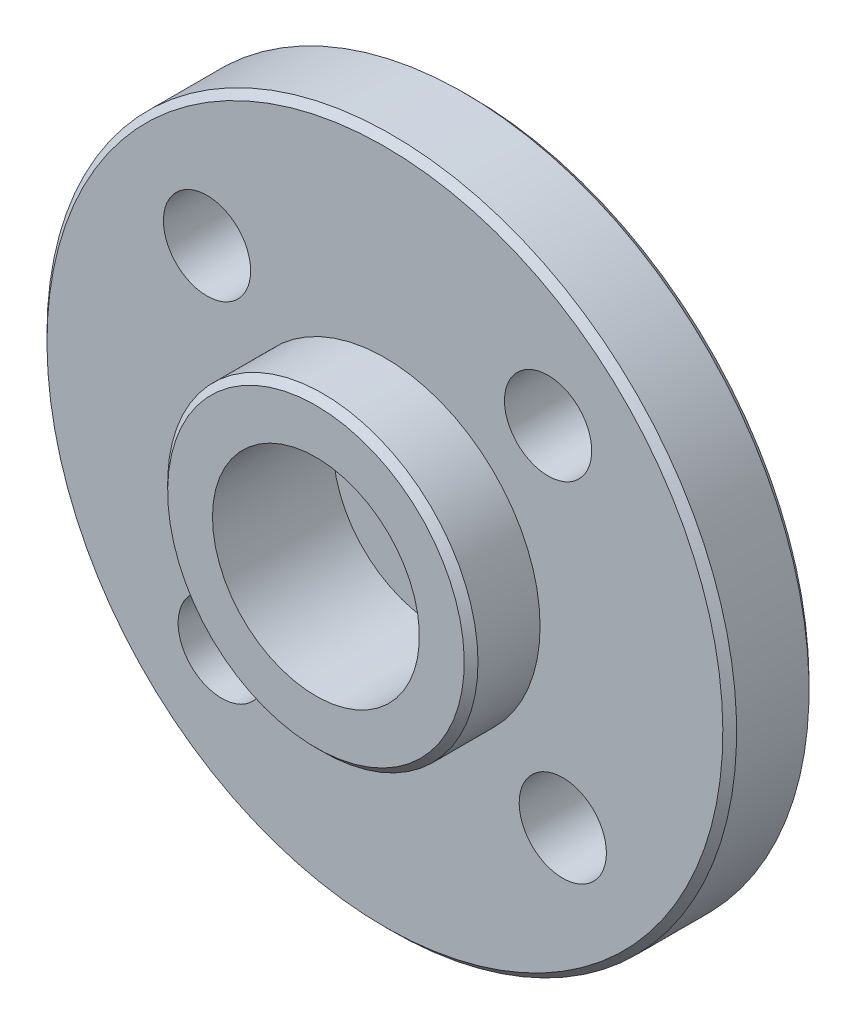
ISO-10303-21;
HEADER;
FILE_DESCRIPTION(('STEP AP214'),'2;1');
FILE_NAME('part.step','',(''),(''),'','','');
FILE_SCHEMA(('AUTOMOTIVE_DESIGN { 1 0 10303 214 1 1 1 1 }'));
ENDSEC;
DATA;
#1=APPLICATION_CONTEXT('core data for automotive mechanical design processes');
#2=APPLICATION_PROTOCOL_DEFINITION('international standard','automotive_design',2000,#1);
#3=PRODUCT_CONTEXT('',#1,'mechanical');
#4=PRODUCT('Part','Part','',(#3));
#5=PRODUCT_RELATED_PRODUCT_CATEGORY('part','',(#4));
#6=PRODUCT_DEFINITION_FORMATION('','',#4);
#7=PRODUCT_DEFINITION_CONTEXT('part definition',#1,'design');
#8=PRODUCT_DEFINITION('design','',#6,#7);
#9=PRODUCT_DEFINITION_SHAPE('','',#8);
#10=(LENGTH_UNIT() NAMED_UNIT(*) SI_UNIT(.MILLI.,.METRE.));
#11=(NAMED_UNIT(*) PLANE_ANGLE_UNIT() SI_UNIT($,.RADIAN.));
#12=(NAMED_UNIT(*) SI_UNIT($,.STERADIAN.) SOLID_ANGLE_UNIT());
#13=UNCERTAINTY_MEASURE_WITH_UNIT(LENGTH_MEASURE(1.E-05),#10,'distance_accuracy_value','');
#14=(GEOMETRIC_REPRESENTATION_CONTEXT(3) GLOBAL_UNCERTAINTY_ASSIGNED_CONTEXT((#13)) GLOBAL_UNIT_ASSIGNED_CONTEXT((#10,
#11,#12)) REPRESENTATION_CONTEXT('',''));
#15=CARTESIAN_POINT('',(0.,0.,0.));
#16=DIRECTION('',(0.,0.,1.));
#17=DIRECTION('',(1.,0.,0.));
#18=AXIS2_PLACEMENT_3D('',#15,#16,#17);
#19=CARTESIAN_POINT('',(44.7320254454184,27.9082880090144,-210.65));
#20=DIRECTION('',(0.,0.,-1.));
#21=DIRECTION('',(0.736898287001867,-0.676003635059542,0.));
#22=AXIS2_PLACEMENT_3D('',#19,#20,#21);
#23=CYLINDRICAL_SURFACE('',#22,1.2645);
#24=CARTESIAN_POINT('',(44.7320254454184,27.9082880090144,-206.15));
#25=DIRECTION('',(0.,0.,-1.));
#26=DIRECTION('',(0.736898287001867,-0.676003635059542,0.));
#27=AXIS2_PLACEMENT_3D('',#24,#25,#26);
#28=CIRCLE('',#27,1.2645);
#29=CARTESIAN_POINT('',(43.8002175615045,28.7630946055472,-206.15));
#30=VERTEX_POINT('',#29);
#31=EDGE_CURVE('E212',#30,#30,#28,.T.);
#32=ORIENTED_EDGE('',*,*,#31,.F.);
#33=DIRECTION('',(0.,0.,-1.));
#34=VECTOR('',#33,1.);
#35=CARTESIAN_POINT('',(43.8002175615045,28.7630946055472,-210.65));
#36=LINE('',#35,#34);
#37=CARTESIAN_POINT('',(43.8002175615045,28.7630946055472,-208.65));
#38=VERTEX_POINT('',#37);
#39=EDGE_CURVE('E11',#30,#38,#36,.T.);
#40=ORIENTED_EDGE('',*,*,#39,.T.);
#41=CARTESIAN_POINT('',(44.7320254454184,27.9082880090144,-208.65));
#42=DIRECTION('',(0.,0.,1.));
#43=DIRECTION('',(0.736898287001867,-0.676003635059542,0.));
#44=AXIS2_PLACEMENT_3D('',#41,#42,#43);
#45=CIRCLE('',#44,1.2645);
#46=EDGE_CURVE('E20',#38,#38,#45,.T.);
#47=ORIENTED_EDGE('',*,*,#46,.F.);
#48=ORIENTED_EDGE('',*,*,#39,.F.);
#49=EDGE_LOOP('',(#32,#40,#47,#48));
#50=FACE_BOUND('',#49,.T.);
#51=ADVANCED_FACE('F16',(#50),#23,.F.);
#52=CARTESIAN_POINT('',(34.8417119909885,27.4820254454181,-210.65));
#53=DIRECTION('',(0.,0.,-1.));
#54=DIRECTION('',(0.676003635059542,0.736898287001867,0.));
#55=AXIS2_PLACEMENT_3D('',#52,#53,#54);
#56=CYLINDRICAL_SURFACE('',#55,1.2645);
#57=CARTESIAN_POINT('',(34.8417119909885,27.4820254454181,-206.15));
#58=DIRECTION('',(0.,0.,-1.));
#59=DIRECTION('',(0.676003635059542,0.736898287001867,0.));
#60=AXIS2_PLACEMENT_3D('',#57,#58,#59);
#61=CIRCLE('',#60,1.2645);
#62=CARTESIAN_POINT('',(33.9869053944557,26.5502175615043,-206.15));
#63=VERTEX_POINT('',#62);
#64=EDGE_CURVE('E156',#63,#63,#61,.T.);
#65=ORIENTED_EDGE('',*,*,#64,.F.);
#66=DIRECTION('',(0.,0.,-1.));
#67=VECTOR('',#66,1.);
#68=CARTESIAN_POINT('',(33.9869053944557,26.5502175615042,-210.65));
#69=LINE('',#68,#67);
#70=CARTESIAN_POINT('',(33.9869053944557,26.5502175615043,-208.65));
#71=VERTEX_POINT('',#70);
#72=EDGE_CURVE('E27',#63,#71,#69,.T.);
#73=ORIENTED_EDGE('',*,*,#72,.T.);
#74=CARTESIAN_POINT('',(34.8417119909885,27.4820254454181,-208.65));
#75=DIRECTION('',(0.,0.,1.));
#76=DIRECTION('',(0.676003635059542,0.736898287001867,0.));
#77=AXIS2_PLACEMENT_3D('',#74,#75,#76);
#78=CIRCLE('',#77,1.2645);
#79=EDGE_CURVE('E167',#71,#71,#78,.T.);
#80=ORIENTED_EDGE('',*,*,#79,.F.);
#81=ORIENTED_EDGE('',*,*,#72,.F.);
#82=EDGE_LOOP('',(#65,#73,#80,#81));
#83=FACE_BOUND('',#82,.T.);
#84=ADVANCED_FACE('F275',(#83),#56,.F.);
#85=CARTESIAN_POINT('',(35.2679745545848,17.5917119909882,-210.65));
#86=DIRECTION('',(0.,0.,-1.));
#87=DIRECTION('',(-0.736898287001867,0.676003635059542,0.));
#88=AXIS2_PLACEMENT_3D('',#85,#86,#87);
#89=CYLINDRICAL_SURFACE('',#88,1.2645);
#90=CARTESIAN_POINT('',(35.2679745545848,17.5917119909883,-206.15));
#91=DIRECTION('',(0.,0.,-1.));
#92=DIRECTION('',(-0.736898287001867,0.676003635059542,0.));
#93=AXIS2_PLACEMENT_3D('',#90,#91,#92);
#94=CIRCLE('',#93,1.2645);
#95=CARTESIAN_POINT('',(36.1997824384987,16.7369053944555,-206.15));
#96=VERTEX_POINT('',#95);
#97=EDGE_CURVE('E151',#96,#96,#94,.T.);
#98=ORIENTED_EDGE('',*,*,#97,.F.);
#99=DIRECTION('',(0.,0.,-1.));
#100=VECTOR('',#99,1.);
#101=CARTESIAN_POINT('',(36.1997824384987,16.7369053944554,-210.65));
#102=LINE('',#101,#100);
#103=CARTESIAN_POINT('',(36.1997824384987,16.7369053944555,-208.65));
#104=VERTEX_POINT('',#103);
#105=EDGE_CURVE('E170',#96,#104,#102,.T.);
#106=ORIENTED_EDGE('',*,*,#105,.T.);
#107=CARTESIAN_POINT('',(35.2679745545848,17.5917119909883,-208.65));
#108=DIRECTION('',(0.,0.,1.));
#109=DIRECTION('',(-0.736898287001867,0.676003635059542,0.));
#110=AXIS2_PLACEMENT_3D('',#107,#108,#109);
#111=CIRCLE('',#110,1.2645);
#112=EDGE_CURVE('E164',#104,#104,#111,.T.);
#113=ORIENTED_EDGE('',*,*,#112,.F.);
#114=ORIENTED_EDGE('',*,*,#105,.F.);
#115=EDGE_LOOP('',(#98,#106,#113,#114));
#116=FACE_BOUND('',#115,.T.);
#117=ADVANCED_FACE('F281',(#116),#89,.F.);
#118=CARTESIAN_POINT('',(45.1582880090147,18.0179745545845,-210.65));
#119=DIRECTION('',(0.,0.,-1.));
#120=DIRECTION('',(-0.676003635059542,-0.736898287001867,0.));
#121=AXIS2_PLACEMENT_3D('',#118,#119,#120);
#122=CYLINDRICAL_SURFACE('',#121,1.2645);
#123=CARTESIAN_POINT('',(45.1582880090147,18.0179745545846,-206.15));
#124=DIRECTION('',(0.,0.,-1.));
#125=DIRECTION('',(-0.676003635059542,-0.736898287001867,0.));
#126=AXIS2_PLACEMENT_3D('',#123,#124,#125);
#127=CIRCLE('',#126,1.2645);
#128=CARTESIAN_POINT('',(46.0130946055474,18.9497824384984,-206.15));
#129=VERTEX_POINT('',#128);
#130=EDGE_CURVE('E155',#129,#129,#127,.T.);
#131=ORIENTED_EDGE('',*,*,#130,.F.);
#132=DIRECTION('',(0.,0.,-1.));
#133=VECTOR('',#132,1.);
#134=CARTESIAN_POINT('',(46.0130946055475,18.9497824384984,-210.65));
#135=LINE('',#134,#133);
#136=CARTESIAN_POINT('',(46.0130946055475,18.9497824384984,-208.65));
#137=VERTEX_POINT('',#136);
#138=EDGE_CURVE('E163',#129,#137,#135,.T.);
#139=ORIENTED_EDGE('',*,*,#138,.T.);
#140=CARTESIAN_POINT('',(45.1582880090147,18.0179745545845,-208.65));
#141=DIRECTION('',(0.,0.,1.));
#142=DIRECTION('',(-0.676003635059542,-0.736898287001867,0.));
#143=AXIS2_PLACEMENT_3D('',#140,#141,#142);
#144=CIRCLE('',#143,1.2645);
#145=EDGE_CURVE('E168',#137,#137,#144,.T.);
#146=ORIENTED_EDGE('',*,*,#145,.F.);
#147=ORIENTED_EDGE('',*,*,#138,.F.);
#148=EDGE_LOOP('',(#131,#139,#146,#147));
#149=FACE_BOUND('',#148,.T.);
#150=ADVANCED_FACE('F250',(#149),#122,.F.);
#151=CARTESIAN_POINT('',(40.0000000000016,22.7500000000013,-207.65));
#152=DIRECTION('',(0.,0.,1.));
#153=DIRECTION('',(0.736898287001867,-0.676003635059542,0.));
#154=AXIS2_PLACEMENT_3D('',#151,#152,#153);
#155=PLANE('',#154);
#156=CARTESIAN_POINT('',(40.0000000000016,22.7500000000013,-207.65));
#157=DIRECTION('',(0.,0.,-1.));
#158=DIRECTION('',(0.736898287001867,-0.676003635059542,0.));
#159=AXIS2_PLACEMENT_3D('',#156,#157,#158);
#160=CIRCLE('',#159,1.5);
#161=CARTESIAN_POINT('',(38.8946525694988,23.7640054525906,-207.65));
#162=VERTEX_POINT('',#161);
#163=EDGE_CURVE('E145',#162,#162,#160,.T.);
#164=ORIENTED_EDGE('',*,*,#163,.T.);
#165=EDGE_LOOP('',(#164));
#166=FACE_BOUND('',#165,.T.);
#167=CARTESIAN_POINT('',(40.0000000000016,22.7500000000013,-207.65));
#168=DIRECTION('',(0.,0.,-1.));
#169=DIRECTION('',(0.736898287001867,-0.676003635059542,0.));
#170=AXIS2_PLACEMENT_3D('',#167,#168,#169);
#171=CIRCLE('',#170,3.);
#172=CARTESIAN_POINT('',(37.789305138996,24.77801090518,-207.65));
#173=VERTEX_POINT('',#172);
#174=EDGE_CURVE('E41',#173,#173,#171,.T.);
#175=ORIENTED_EDGE('',*,*,#174,.F.);
#176=EDGE_LOOP('',(#175));
#177=FACE_BOUND('',#176,.T.);
#178=ADVANCED_FACE('F292',(#166,#177),#155,.T.);
#179=CARTESIAN_POINT('',(40.0000000000016,22.7500000000014,-204.15));
#180=DIRECTION('',(0.,0.,-1.));
#181=DIRECTION('',(0.736898287001867,-0.676003635059542,0.));
#182=AXIS2_PLACEMENT_3D('',#179,#180,#181);
#183=CYLINDRICAL_SURFACE('',#182,3.);
#184=CARTESIAN_POINT('',(40.0000000000016,22.7500000000014,-204.15));
#185=DIRECTION('',(0.,0.,-1.));
#186=DIRECTION('',(0.736898287001867,-0.676003635059542,0.));
#187=AXIS2_PLACEMENT_3D('',#184,#185,#186);
#188=CIRCLE('',#187,3.);
#189=CARTESIAN_POINT('',(37.789305138996,24.77801090518,-204.15));
#190=VERTEX_POINT('',#189);
#191=EDGE_CURVE('E159',#190,#190,#188,.T.);
#192=ORIENTED_EDGE('',*,*,#191,.F.);
#193=DIRECTION('',(0.,0.,-1.));
#194=VECTOR('',#193,1.);
#195=CARTESIAN_POINT('',(37.789305138996,24.77801090518,-204.15));
#196=LINE('',#195,#194);
#197=EDGE_CURVE('E157',#190,#173,#196,.T.);
#198=ORIENTED_EDGE('',*,*,#197,.T.);
#199=ORIENTED_EDGE('',*,*,#174,.T.);
#200=ORIENTED_EDGE('',*,*,#197,.F.);
#201=EDGE_LOOP('',(#192,#198,#199,#200));
#202=FACE_BOUND('',#201,.T.);
#203=ADVANCED_FACE('F289',(#202),#183,.F.);
#204=CARTESIAN_POINT('',(40.0000000000016,22.7500000000014,-204.15));
#205=DIRECTION('',(0.,0.,1.));
#206=DIRECTION('',(0.736898287001867,-0.676003635059542,0.));
#207=AXIS2_PLACEMENT_3D('',#204,#205,#206);
#208=PLANE('',#207);
#209=ORIENTED_EDGE('',*,*,#191,.T.);
#210=EDGE_LOOP('',(#209));
#211=FACE_BOUND('',#210,.T.);
#212=CARTESIAN_POINT('',(40.0000000000016,22.7500000000014,-204.15));
#213=DIRECTION('',(0.,0.,-1.));
#214=DIRECTION('',(0.736898287001867,-0.676003635059542,0.));
#215=AXIS2_PLACEMENT_3D('',#212,#213,#214);
#216=CIRCLE('',#215,4.3);
#217=CARTESIAN_POINT('',(36.8313373658936,25.6568156307574,-204.15));
#218=VERTEX_POINT('',#217);
#219=EDGE_CURVE('E181',#218,#218,#216,.T.);
#220=ORIENTED_EDGE('',*,*,#219,.F.);
#221=EDGE_LOOP('',(#220));
#222=FACE_BOUND('',#221,.T.);
#223=ADVANCED_FACE('F286',(#211,#222),#208,.T.);
#224=CARTESIAN_POINT('',(40.0000000000016,22.7500000000013,-206.15));
#225=DIRECTION('',(0.,0.,1.));
#226=DIRECTION('',(0.736898287001867,-0.676003635059542,0.));
#227=AXIS2_PLACEMENT_3D('',#224,#225,#226);
#228=CYLINDRICAL_SURFACE('',#227,4.5);
#229=CARTESIAN_POINT('',(40.0000000000016,22.7500000000014,-204.35));
#230=DIRECTION('',(0.,0.,1.));
#231=DIRECTION('',(0.736898287001867,-0.676003635059542,0.));
#232=AXIS2_PLACEMENT_3D('',#229,#230,#231);
#233=CIRCLE('',#232,4.5);
#234=CARTESIAN_POINT('',(36.6839577084932,25.7920163577693,-204.35));
#235=VERTEX_POINT('',#234);
#236=EDGE_CURVE('E180',#235,#235,#233,.T.);
#237=ORIENTED_EDGE('',*,*,#236,.F.);
#238=DIRECTION('',(0.,0.,-1.));
#239=VECTOR('',#238,1.);
#240=CARTESIAN_POINT('',(36.6839577084932,25.7920163577693,-206.15));
#241=LINE('',#240,#239);
#242=CARTESIAN_POINT('',(36.6839577084932,25.7920163577693,-206.15));
#243=VERTEX_POINT('',#242);
#244=EDGE_CURVE('E176',#235,#243,#241,.T.);
#245=ORIENTED_EDGE('',*,*,#244,.T.);
#246=CARTESIAN_POINT('',(40.0000000000016,22.7500000000013,-206.15));
#247=DIRECTION('',(0.,0.,-1.));
#248=DIRECTION('',(0.736898287001867,-0.676003635059542,0.));
#249=AXIS2_PLACEMENT_3D('',#246,#247,#248);
#250=CIRCLE('',#249,4.5);
#251=EDGE_CURVE('E214',#243,#243,#250,.T.);
#252=ORIENTED_EDGE('',*,*,#251,.F.);
#253=ORIENTED_EDGE('',*,*,#244,.F.);
#254=EDGE_LOOP('',(#237,#245,#252,#253));
#255=FACE_BOUND('',#254,.T.);
#256=ADVANCED_FACE('F232',(#255),#228,.T.);
#257=CARTESIAN_POINT('',(40.0000000000016,22.7500000000014,-204.25));
#258=DIRECTION('',(0.,0.,-1.));
#259=DIRECTION('',(0.736898287001867,-0.676003635059542,0.));
#260=AXIS2_PLACEMENT_3D('',#257,#258,#259);
#261=CONICAL_SURFACE('',#260,4.4,0.785398163397448);
#262=ORIENTED_EDGE('',*,*,#219,.T.);
#263=DIRECTION('',(-0.52106577578377,0.478006754457351,-0.707106781186554));
#264=VECTOR('',#263,1.);
#265=CARTESIAN_POINT('',(36.7576475371934,25.7244159942633,-204.25));
#266=LINE('',#265,#264);
#267=EDGE_CURVE('E177',#218,#235,#266,.T.);
#268=ORIENTED_EDGE('',*,*,#267,.T.);
#269=ORIENTED_EDGE('',*,*,#236,.T.);
#270=ORIENTED_EDGE('',*,*,#267,.F.);
#271=EDGE_LOOP('',(#262,#268,#269,#270));
#272=FACE_BOUND('',#271,.T.);
#273=ADVANCED_FACE('F294',(#272),#261,.T.);
#274=CARTESIAN_POINT('',(40.0000000000016,22.7500000000013,-206.15));
#275=DIRECTION('',(0.,0.,1.));
#276=DIRECTION('',(0.736898287001867,-0.676003635059542,0.));
#277=AXIS2_PLACEMENT_3D('',#274,#275,#276);
#278=PLANE('',#277);
#279=ORIENTED_EDGE('',*,*,#130,.T.);
#280=EDGE_LOOP('',(#279));
#281=FACE_BOUND('',#280,.T.);
#282=ORIENTED_EDGE('',*,*,#97,.T.);
#283=EDGE_LOOP('',(#282));
#284=FACE_BOUND('',#283,.T.);
#285=ORIENTED_EDGE('',*,*,#64,.T.);
#286=EDGE_LOOP('',(#285));
#287=FACE_BOUND('',#286,.T.);
#288=ORIENTED_EDGE('',*,*,#31,.T.);
#289=EDGE_LOOP('',(#288));
#290=FACE_BOUND('',#289,.T.);
#291=ORIENTED_EDGE('',*,*,#251,.T.);
#292=EDGE_LOOP('',(#291));
#293=FACE_BOUND('',#292,.T.);
#294=CARTESIAN_POINT('',(40.0000000000016,22.7500000000013,-206.15));
#295=DIRECTION('',(0.,0.,-1.));
#296=DIRECTION('',(0.736898287001867,-0.676003635059542,0.));
#297=AXIS2_PLACEMENT_3D('',#294,#295,#296);
#298=CIRCLE('',#297,9.8);
#299=CARTESIAN_POINT('',(32.7783967873833,29.3748356235849,-206.15));
#300=VERTEX_POINT('',#299);
#301=EDGE_CURVE('E196',#300,#300,#298,.T.);
#302=ORIENTED_EDGE('',*,*,#301,.F.);
#303=EDGE_LOOP('',(#302));
#304=FACE_BOUND('',#303,.T.);
#305=ADVANCED_FACE('F234',(#281,#284,#287,#290,#293,#304),#278,.T.);
#306=CARTESIAN_POINT('',(40.0000000000016,22.7500000000013,-206.25));
#307=DIRECTION('',(0.,0.,-1.));
#308=DIRECTION('',(0.736898287001867,-0.676003635059542,0.));
#309=AXIS2_PLACEMENT_3D('',#306,#307,#308);
#310=CONICAL_SURFACE('',#309,9.9,0.785398163397448);
#311=ORIENTED_EDGE('',*,*,#301,.T.);
#312=DIRECTION('',(-0.52106577578377,0.478006754457351,-0.707106781186554));
#313=VECTOR('',#312,1.);
#314=CARTESIAN_POINT('',(32.7047069586831,29.4424359870908,-206.25));
#315=LINE('',#314,#313);
#316=CARTESIAN_POINT('',(32.6310171299829,29.5100363505968,-206.35));
#317=VERTEX_POINT('',#316);
#318=EDGE_CURVE('E203',#300,#317,#315,.T.);
#319=ORIENTED_EDGE('',*,*,#318,.T.);
#320=CARTESIAN_POINT('',(40.0000000000016,22.7500000000013,-206.35));
#321=DIRECTION('',(0.,0.,1.));
#322=DIRECTION('',(0.736898287001867,-0.676003635059542,0.));
#323=AXIS2_PLACEMENT_3D('',#320,#321,#322);
#324=CIRCLE('',#323,10.);
#325=EDGE_CURVE('E183',#317,#317,#324,.T.);
#326=ORIENTED_EDGE('',*,*,#325,.T.);
#327=ORIENTED_EDGE('',*,*,#318,.F.);
#328=EDGE_LOOP('',(#311,#319,#326,#327));
#329=FACE_BOUND('',#328,.T.);
#330=ADVANCED_FACE('F18',(#329),#310,.T.);
#331=CARTESIAN_POINT('',(40.0000000000016,22.7500000000013,-208.65));
#332=DIRECTION('',(0.,0.,1.));
#333=DIRECTION('',(0.736898287001867,-0.676003635059542,0.));
#334=AXIS2_PLACEMENT_3D('',#331,#332,#333);
#335=CYLINDRICAL_SURFACE('',#334,10.);
#336=ORIENTED_EDGE('',*,*,#325,.F.);
#337=DIRECTION('',(0.,0.,-1.));
#338=VECTOR('',#337,1.);
#339=CARTESIAN_POINT('',(32.6310171299829,29.5100363505967,-208.65));
#340=LINE('',#339,#338);
#341=CARTESIAN_POINT('',(32.6310171299829,29.5100363505967,-208.45));
#342=VERTEX_POINT('',#341);
#343=EDGE_CURVE('E93',#317,#342,#340,.T.);
#344=ORIENTED_EDGE('',*,*,#343,.T.);
#345=CARTESIAN_POINT('',(40.0000000000016,22.7500000000013,-208.45));
#346=DIRECTION('',(0.,0.,-1.));
#347=DIRECTION('',(0.736898287001867,-0.676003635059542,0.));
#348=AXIS2_PLACEMENT_3D('',#345,#346,#347);
#349=CIRCLE('',#348,10.);
#350=EDGE_CURVE('E147',#342,#342,#349,.T.);
#351=ORIENTED_EDGE('',*,*,#350,.F.);
#352=ORIENTED_EDGE('',*,*,#343,.F.);
#353=EDGE_LOOP('',(#336,#344,#351,#352));
#354=FACE_BOUND('',#353,.T.);
#355=ADVANCED_FACE('F263',(#354),#335,.T.);
#356=CARTESIAN_POINT('',(40.0000000000016,22.7500000000013,-208.55));
#357=DIRECTION('',(0.,0.,1.));
#358=DIRECTION('',(0.736898287001867,-0.676003635059542,0.));
#359=AXIS2_PLACEMENT_3D('',#356,#357,#358);
#360=CONICAL_SURFACE('',#359,9.9,0.785398163397449);
#361=ORIENTED_EDGE('',*,*,#350,.T.);
#362=DIRECTION('',(0.521065775783772,-0.478006754457366,-0.707106781186541));
#363=VECTOR('',#362,1.);
#364=CARTESIAN_POINT('',(32.7047069586831,29.4424359870908,-208.55));
#365=LINE('',#364,#363);
#366=CARTESIAN_POINT('',(32.7783967873833,29.3748356235848,-208.65));
#367=VERTEX_POINT('',#366);
#368=EDGE_CURVE('E150',#342,#367,#365,.T.);
#369=ORIENTED_EDGE('',*,*,#368,.T.);
#370=CARTESIAN_POINT('',(40.0000000000016,22.7500000000013,-208.65));
#371=DIRECTION('',(0.,0.,1.));
#372=DIRECTION('',(0.736898287001867,-0.676003635059542,0.));
#373=AXIS2_PLACEMENT_3D('',#370,#371,#372);
#374=CIRCLE('',#373,9.8);
#375=EDGE_CURVE('E139',#367,#367,#374,.T.);
#376=ORIENTED_EDGE('',*,*,#375,.T.);
#377=ORIENTED_EDGE('',*,*,#368,.F.);
#378=EDGE_LOOP('',(#361,#369,#376,#377));
#379=FACE_BOUND('',#378,.T.);
#380=ADVANCED_FACE('F262',(#379),#360,.T.);
#381=CARTESIAN_POINT('',(40.0000000000016,22.7500000000013,-207.65));
#382=DIRECTION('',(0.,0.,-1.));
#383=DIRECTION('',(0.736898287001867,-0.676003635059542,0.));
#384=AXIS2_PLACEMENT_3D('',#381,#382,#383);
#385=CYLINDRICAL_SURFACE('',#384,1.5);
#386=ORIENTED_EDGE('',*,*,#163,.F.);
#387=DIRECTION('',(0.,0.,-1.));
#388=VECTOR('',#387,1.);
#389=CARTESIAN_POINT('',(38.8946525694988,23.7640054525906,-207.65));
#390=LINE('',#389,#388);
#391=CARTESIAN_POINT('',(38.8946525694988,23.7640054525906,-208.45));
#392=VERTEX_POINT('',#391);
#393=EDGE_CURVE('E103',#162,#392,#390,.T.);
#394=ORIENTED_EDGE('',*,*,#393,.T.);
#395=CARTESIAN_POINT('',(40.0000000000016,22.7500000000013,-208.45));
#396=DIRECTION('',(0.,0.,1.));
#397=DIRECTION('',(0.736898287001867,-0.676003635059542,0.));
#398=AXIS2_PLACEMENT_3D('',#395,#396,#397);
#399=CIRCLE('',#398,1.5);
#400=EDGE_CURVE('E132',#392,#392,#399,.T.);
#401=ORIENTED_EDGE('',*,*,#400,.F.);
#402=ORIENTED_EDGE('',*,*,#393,.F.);
#403=EDGE_LOOP('',(#386,#394,#401,#402));
#404=FACE_BOUND('',#403,.T.);
#405=ADVANCED_FACE('F255',(#404),#385,.F.);
#406=CARTESIAN_POINT('',(40.0000000000016,22.7500000000013,-208.65));
#407=DIRECTION('',(0.,0.,1.));
#408=DIRECTION('',(0.736898287001867,-0.676003635059542,0.));
#409=AXIS2_PLACEMENT_3D('',#406,#407,#408);
#410=PLANE('',#409);
#411=CARTESIAN_POINT('',(40.0000000000016,22.7500000000013,-208.65));
#412=DIRECTION('',(0.,0.,-1.));
#413=DIRECTION('',(0.736898287001867,-0.676003635059542,0.));
#414=AXIS2_PLACEMENT_3D('',#411,#412,#413);
#415=CIRCLE('',#414,1.7);
#416=CARTESIAN_POINT('',(38.7472729120984,23.8992061796025,-208.65));
#417=VERTEX_POINT('',#416);
#418=EDGE_CURVE('E131',#417,#417,#415,.T.);
#419=ORIENTED_EDGE('',*,*,#418,.F.);
#420=EDGE_LOOP('',(#419));
#421=FACE_BOUND('',#420,.T.);
#422=ORIENTED_EDGE('',*,*,#46,.T.);
#423=EDGE_LOOP('',(#422));
#424=FACE_BOUND('',#423,.T.);
#425=ORIENTED_EDGE('',*,*,#79,.T.);
#426=EDGE_LOOP('',(#425));
#427=FACE_BOUND('',#426,.T.);
#428=ORIENTED_EDGE('',*,*,#112,.T.);
#429=EDGE_LOOP('',(#428));
#430=FACE_BOUND('',#429,.T.);
#431=ORIENTED_EDGE('',*,*,#145,.T.);
#432=EDGE_LOOP('',(#431));
#433=FACE_BOUND('',#432,.T.);
#434=ORIENTED_EDGE('',*,*,#375,.F.);
#435=EDGE_LOOP('',(#434));
#436=FACE_BOUND('',#435,.T.);
#437=ADVANCED_FACE('F252',(#421,#424,#427,#430,#433,#436),#410,.F.);
#438=CARTESIAN_POINT('',(40.0000000000016,22.7500000000013,-208.55));
#439=DIRECTION('',(0.,0.,-1.));
#440=DIRECTION('',(0.736898287001867,-0.676003635059542,0.));
#441=AXIS2_PLACEMENT_3D('',#438,#439,#440);
#442=CONICAL_SURFACE('',#441,1.6,0.785398163397449);
#443=ORIENTED_EDGE('',*,*,#418,.T.);
#444=DIRECTION('',(0.52106577578377,-0.478006754457351,0.707106781186553));
#445=VECTOR('',#444,1.);
#446=CARTESIAN_POINT('',(38.8209627407986,23.8316058160966,-208.55));
#447=LINE('',#446,#445);
#448=EDGE_CURVE('E128',#417,#392,#447,.T.);
#449=ORIENTED_EDGE('',*,*,#448,.T.);
#450=ORIENTED_EDGE('',*,*,#400,.T.);
#451=ORIENTED_EDGE('',*,*,#448,.F.);
#452=EDGE_LOOP('',(#443,#449,#450,#451));
#453=FACE_BOUND('',#452,.T.);
#454=ADVANCED_FACE('F129',(#453),#442,.F.);
#455=CLOSED_SHELL('',(#51,#84,#117,#150,#178,#203,#223,#256,#273,#305,#330,#355,#380,#405,#437,#454));
#456=MANIFOLD_SOLID_BREP('B1',#455);
#457=ADVANCED_BREP_SHAPE_REPRESENTATION('',(#18,#456),#14);
#458=SHAPE_DEFINITION_REPRESENTATION(#9,#457);
ENDSEC;
END-ISO-10303-21;
